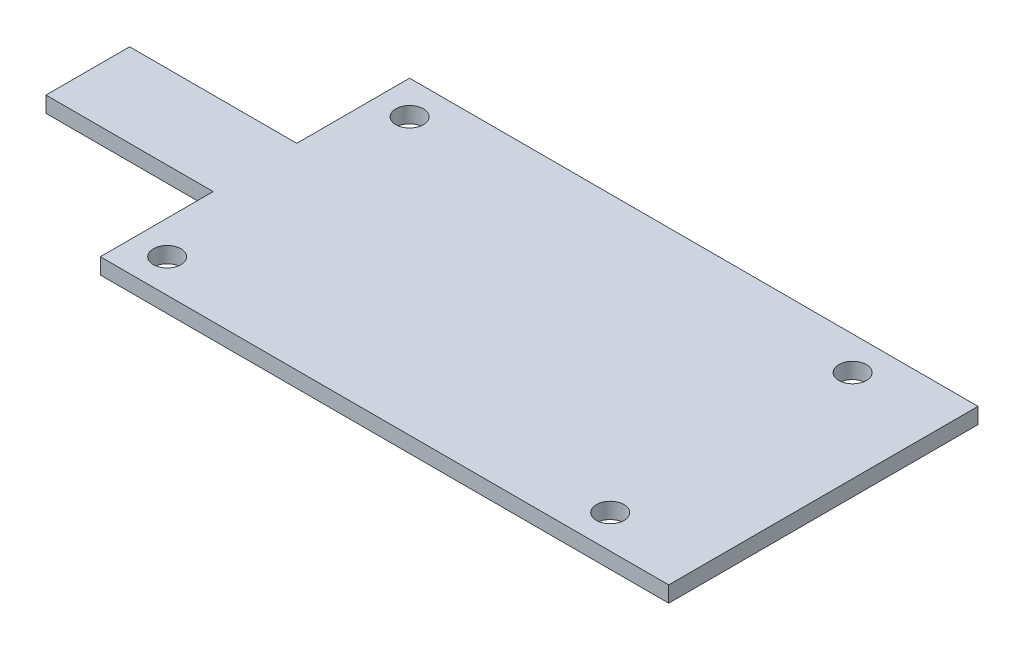
ISO-10303-21;
HEADER;
FILE_DESCRIPTION(('STEP AP214'),'2;1');
FILE_NAME('part.step','',(''),(''),'','','');
FILE_SCHEMA(('AUTOMOTIVE_DESIGN { 1 0 10303 214 1 1 1 1 }'));
ENDSEC;
DATA;
#1=APPLICATION_CONTEXT('core data for automotive mechanical design processes');
#2=APPLICATION_PROTOCOL_DEFINITION('international standard','automotive_design',2000,#1);
#3=PRODUCT_CONTEXT('',#1,'mechanical');
#4=PRODUCT('Part','Part','',(#3));
#5=PRODUCT_RELATED_PRODUCT_CATEGORY('part','',(#4));
#6=PRODUCT_DEFINITION_FORMATION('','',#4);
#7=PRODUCT_DEFINITION_CONTEXT('part definition',#1,'design');
#8=PRODUCT_DEFINITION('design','',#6,#7);
#9=PRODUCT_DEFINITION_SHAPE('','',#8);
#10=(LENGTH_UNIT() NAMED_UNIT(*) SI_UNIT(.MILLI.,.METRE.));
#11=(NAMED_UNIT(*) PLANE_ANGLE_UNIT() SI_UNIT($,.RADIAN.));
#12=(NAMED_UNIT(*) SI_UNIT($,.STERADIAN.) SOLID_ANGLE_UNIT());
#13=UNCERTAINTY_MEASURE_WITH_UNIT(LENGTH_MEASURE(1.E-05),#10,'distance_accuracy_value','');
#14=(GEOMETRIC_REPRESENTATION_CONTEXT(3) GLOBAL_UNCERTAINTY_ASSIGNED_CONTEXT((#13)) GLOBAL_UNIT_ASSIGNED_CONTEXT((#10,
#11,#12)) REPRESENTATION_CONTEXT('',''));
#15=CARTESIAN_POINT('',(0.,0.,0.));
#16=DIRECTION('',(0.,0.,1.));
#17=DIRECTION('',(1.,0.,0.));
#18=AXIS2_PLACEMENT_3D('',#15,#16,#17);
#19=CARTESIAN_POINT('',(0.,1.9,0.));
#20=DIRECTION('',(0.,1.,0.));
#21=DIRECTION('',(0.,0.,1.));
#22=AXIS2_PLACEMENT_3D('',#19,#20,#21);
#23=PLANE('',#22);
#24=CARTESIAN_POINT('',(26.5,1.9,14.5));
#25=DIRECTION('',(0.,1.,0.));
#26=DIRECTION('',(0.,0.,1.));
#27=AXIS2_PLACEMENT_3D('',#24,#25,#26);
#28=CIRCLE('',#27,1.65);
#29=CARTESIAN_POINT('',(26.5,1.9,12.85));
#30=VERTEX_POINT('',#29);
#31=EDGE_CURVE('E188',#30,#30,#28,.T.);
#32=ORIENTED_EDGE('',*,*,#31,.F.);
#33=EDGE_LOOP('',(#32));
#34=FACE_BOUND('',#33,.T.);
#35=CARTESIAN_POINT('',(-26.5,1.9,-14.5));
#36=DIRECTION('',(0.,1.,0.));
#37=DIRECTION('',(0.,0.,1.));
#38=AXIS2_PLACEMENT_3D('',#35,#36,#37);
#39=CIRCLE('',#38,1.65);
#40=CARTESIAN_POINT('',(-26.5,1.9,-16.15));
#41=VERTEX_POINT('',#40);
#42=EDGE_CURVE('E134',#41,#41,#39,.T.);
#43=ORIENTED_EDGE('',*,*,#42,.F.);
#44=EDGE_LOOP('',(#43));
#45=FACE_BOUND('',#44,.T.);
#46=DIRECTION('',(0.,0.,1.));
#47=VECTOR('',#46,1.);
#48=CARTESIAN_POINT('',(-30.5,1.9,-18.5));
#49=LINE('',#48,#47);
#50=CARTESIAN_POINT('',(-30.5,1.9,-18.5));
#51=VERTEX_POINT('',#50);
#52=CARTESIAN_POINT('',(-30.5,1.9,-5.));
#53=VERTEX_POINT('',#52);
#54=EDGE_CURVE('E147',#51,#53,#49,.T.);
#55=ORIENTED_EDGE('',*,*,#54,.T.);
#56=DIRECTION('',(-1.,0.,0.));
#57=VECTOR('',#56,1.);
#58=CARTESIAN_POINT('',(-50.5,1.9,-5.));
#59=LINE('',#58,#57);
#60=CARTESIAN_POINT('',(-50.5,1.9,-5.));
#61=VERTEX_POINT('',#60);
#62=EDGE_CURVE('E91',#53,#61,#59,.T.);
#63=ORIENTED_EDGE('',*,*,#62,.T.);
#64=DIRECTION('',(0.,0.,1.));
#65=VECTOR('',#64,1.);
#66=CARTESIAN_POINT('',(-50.5,1.9,5.));
#67=LINE('',#66,#65);
#68=CARTESIAN_POINT('',(-50.5,1.9,5.));
#69=VERTEX_POINT('',#68);
#70=EDGE_CURVE('E162',#61,#69,#67,.T.);
#71=ORIENTED_EDGE('',*,*,#70,.T.);
#72=DIRECTION('',(1.,0.,0.));
#73=VECTOR('',#72,1.);
#74=CARTESIAN_POINT('',(-30.5,1.9,5.));
#75=LINE('',#74,#73);
#76=CARTESIAN_POINT('',(-30.5,1.9,5.));
#77=VERTEX_POINT('',#76);
#78=EDGE_CURVE('E173',#69,#77,#75,.T.);
#79=ORIENTED_EDGE('',*,*,#78,.T.);
#80=DIRECTION('',(0.,0.,1.));
#81=VECTOR('',#80,1.);
#82=CARTESIAN_POINT('',(-30.5,1.9,18.5));
#83=LINE('',#82,#81);
#84=CARTESIAN_POINT('',(-30.5,1.9,18.5));
#85=VERTEX_POINT('',#84);
#86=EDGE_CURVE('E111',#77,#85,#83,.T.);
#87=ORIENTED_EDGE('',*,*,#86,.T.);
#88=DIRECTION('',(1.,0.,0.));
#89=VECTOR('',#88,1.);
#90=CARTESIAN_POINT('',(-30.5,1.9,18.5));
#91=LINE('',#90,#89);
#92=CARTESIAN_POINT('',(37.5,1.9,18.5));
#93=VERTEX_POINT('',#92);
#94=EDGE_CURVE('E104',#85,#93,#91,.T.);
#95=ORIENTED_EDGE('',*,*,#94,.T.);
#96=DIRECTION('',(0.,0.,-1.));
#97=VECTOR('',#96,1.);
#98=CARTESIAN_POINT('',(37.5,1.9,-18.5));
#99=LINE('',#98,#97);
#100=CARTESIAN_POINT('',(37.5,1.9,-18.5));
#101=VERTEX_POINT('',#100);
#102=EDGE_CURVE('E108',#93,#101,#99,.T.);
#103=ORIENTED_EDGE('',*,*,#102,.T.);
#104=DIRECTION('',(-1.,0.,0.));
#105=VECTOR('',#104,1.);
#106=CARTESIAN_POINT('',(30.5,1.9,-18.5));
#107=LINE('',#106,#105);
#108=EDGE_CURVE('E50',#101,#51,#107,.T.);
#109=ORIENTED_EDGE('',*,*,#108,.T.);
#110=EDGE_LOOP('',(#55,#63,#71,#79,#87,#95,#103,#109));
#111=FACE_BOUND('',#110,.T.);
#112=CARTESIAN_POINT('',(26.5,1.9,-14.5));
#113=DIRECTION('',(0.,1.,0.));
#114=DIRECTION('',(0.,0.,1.));
#115=AXIS2_PLACEMENT_3D('',#112,#113,#114);
#116=CIRCLE('',#115,1.65);
#117=CARTESIAN_POINT('',(26.5,1.9,-16.15));
#118=VERTEX_POINT('',#117);
#119=EDGE_CURVE('E182',#118,#118,#116,.T.);
#120=ORIENTED_EDGE('',*,*,#119,.F.);
#121=EDGE_LOOP('',(#120));
#122=FACE_BOUND('',#121,.T.);
#123=CARTESIAN_POINT('',(-26.5,1.9,14.5));
#124=DIRECTION('',(0.,1.,0.));
#125=DIRECTION('',(0.,0.,1.));
#126=AXIS2_PLACEMENT_3D('',#123,#124,#125);
#127=CIRCLE('',#126,1.65);
#128=CARTESIAN_POINT('',(-26.5,1.9,12.85));
#129=VERTEX_POINT('',#128);
#130=EDGE_CURVE('E194',#129,#129,#127,.T.);
#131=ORIENTED_EDGE('',*,*,#130,.F.);
#132=EDGE_LOOP('',(#131));
#133=FACE_BOUND('',#132,.T.);
#134=ADVANCED_FACE('F33',(#34,#45,#111,#122,#133),#23,.T.);
#135=CARTESIAN_POINT('',(0.,0.,0.));
#136=DIRECTION('',(0.,1.,0.));
#137=DIRECTION('',(0.,0.,1.));
#138=AXIS2_PLACEMENT_3D('',#135,#136,#137);
#139=PLANE('',#138);
#140=DIRECTION('',(0.,0.,1.));
#141=VECTOR('',#140,1.);
#142=CARTESIAN_POINT('',(-30.5,0.,-18.5));
#143=LINE('',#142,#141);
#144=CARTESIAN_POINT('',(-30.5,0.,-18.5));
#145=VERTEX_POINT('',#144);
#146=CARTESIAN_POINT('',(-30.5,0.,-5.));
#147=VERTEX_POINT('',#146);
#148=EDGE_CURVE('E130',#145,#147,#143,.T.);
#149=ORIENTED_EDGE('',*,*,#148,.F.);
#150=DIRECTION('',(-1.,0.,0.));
#151=VECTOR('',#150,1.);
#152=CARTESIAN_POINT('',(-30.5,0.,-18.5));
#153=LINE('',#152,#151);
#154=CARTESIAN_POINT('',(37.5,0.,-18.5));
#155=VERTEX_POINT('',#154);
#156=EDGE_CURVE('E79',#155,#145,#153,.T.);
#157=ORIENTED_EDGE('',*,*,#156,.F.);
#158=DIRECTION('',(0.,0.,-1.));
#159=VECTOR('',#158,1.);
#160=CARTESIAN_POINT('',(37.5,0.,-18.5));
#161=LINE('',#160,#159);
#162=CARTESIAN_POINT('',(37.5,0.,18.5));
#163=VERTEX_POINT('',#162);
#164=EDGE_CURVE('E144',#163,#155,#161,.T.);
#165=ORIENTED_EDGE('',*,*,#164,.F.);
#166=DIRECTION('',(1.,0.,0.));
#167=VECTOR('',#166,1.);
#168=CARTESIAN_POINT('',(37.5,0.,18.5));
#169=LINE('',#168,#167);
#170=CARTESIAN_POINT('',(-30.5,0.,18.5));
#171=VERTEX_POINT('',#170);
#172=EDGE_CURVE('E119',#171,#163,#169,.T.);
#173=ORIENTED_EDGE('',*,*,#172,.F.);
#174=DIRECTION('',(0.,0.,1.));
#175=VECTOR('',#174,1.);
#176=CARTESIAN_POINT('',(-30.5,0.,18.5));
#177=LINE('',#176,#175);
#178=CARTESIAN_POINT('',(-30.5,0.,5.));
#179=VERTEX_POINT('',#178);
#180=EDGE_CURVE('E140',#179,#171,#177,.T.);
#181=ORIENTED_EDGE('',*,*,#180,.F.);
#182=DIRECTION('',(1.,0.,0.));
#183=VECTOR('',#182,1.);
#184=CARTESIAN_POINT('',(-30.5,0.,5.));
#185=LINE('',#184,#183);
#186=CARTESIAN_POINT('',(-50.5,0.,5.));
#187=VERTEX_POINT('',#186);
#188=EDGE_CURVE('E138',#187,#179,#185,.T.);
#189=ORIENTED_EDGE('',*,*,#188,.F.);
#190=DIRECTION('',(0.,0.,1.));
#191=VECTOR('',#190,1.);
#192=CARTESIAN_POINT('',(-50.5,0.,5.));
#193=LINE('',#192,#191);
#194=CARTESIAN_POINT('',(-50.5,0.,-5.));
#195=VERTEX_POINT('',#194);
#196=EDGE_CURVE('E136',#195,#187,#193,.T.);
#197=ORIENTED_EDGE('',*,*,#196,.F.);
#198=DIRECTION('',(-1.,0.,0.));
#199=VECTOR('',#198,1.);
#200=CARTESIAN_POINT('',(-50.5,0.,-5.));
#201=LINE('',#200,#199);
#202=EDGE_CURVE('E133',#147,#195,#201,.T.);
#203=ORIENTED_EDGE('',*,*,#202,.F.);
#204=EDGE_LOOP('',(#149,#157,#165,#173,#181,#189,#197,#203));
#205=FACE_BOUND('',#204,.T.);
#206=CARTESIAN_POINT('',(-26.5,0.,-14.5));
#207=DIRECTION('',(0.,1.,0.));
#208=DIRECTION('',(0.,0.,1.));
#209=AXIS2_PLACEMENT_3D('',#206,#207,#208);
#210=CIRCLE('',#209,1.65);
#211=CARTESIAN_POINT('',(-26.5,0.,-16.15));
#212=VERTEX_POINT('',#211);
#213=EDGE_CURVE('E179',#212,#212,#210,.T.);
#214=ORIENTED_EDGE('',*,*,#213,.T.);
#215=EDGE_LOOP('',(#214));
#216=FACE_BOUND('',#215,.T.);
#217=CARTESIAN_POINT('',(26.5,0.,-14.5));
#218=DIRECTION('',(0.,1.,0.));
#219=DIRECTION('',(0.,0.,1.));
#220=AXIS2_PLACEMENT_3D('',#217,#218,#219);
#221=CIRCLE('',#220,1.65);
#222=CARTESIAN_POINT('',(26.5,0.,-16.15));
#223=VERTEX_POINT('',#222);
#224=EDGE_CURVE('E185',#223,#223,#221,.T.);
#225=ORIENTED_EDGE('',*,*,#224,.T.);
#226=EDGE_LOOP('',(#225));
#227=FACE_BOUND('',#226,.T.);
#228=CARTESIAN_POINT('',(26.5,0.,14.5));
#229=DIRECTION('',(0.,1.,0.));
#230=DIRECTION('',(0.,0.,1.));
#231=AXIS2_PLACEMENT_3D('',#228,#229,#230);
#232=CIRCLE('',#231,1.65);
#233=CARTESIAN_POINT('',(26.5,0.,12.85));
#234=VERTEX_POINT('',#233);
#235=EDGE_CURVE('E191',#234,#234,#232,.T.);
#236=ORIENTED_EDGE('',*,*,#235,.T.);
#237=EDGE_LOOP('',(#236));
#238=FACE_BOUND('',#237,.T.);
#239=CARTESIAN_POINT('',(-26.5,0.,14.5));
#240=DIRECTION('',(0.,1.,0.));
#241=DIRECTION('',(0.,0.,1.));
#242=AXIS2_PLACEMENT_3D('',#239,#240,#241);
#243=CIRCLE('',#242,1.65);
#244=CARTESIAN_POINT('',(-26.5,0.,12.85));
#245=VERTEX_POINT('',#244);
#246=EDGE_CURVE('E197',#245,#245,#243,.T.);
#247=ORIENTED_EDGE('',*,*,#246,.T.);
#248=EDGE_LOOP('',(#247));
#249=FACE_BOUND('',#248,.T.);
#250=ADVANCED_FACE('F164',(#205,#216,#227,#238,#249),#139,.F.);
#251=CARTESIAN_POINT('',(-30.5,1.9,-18.5));
#252=DIRECTION('',(1.,0.,0.));
#253=DIRECTION('',(0.,0.,-1.));
#254=AXIS2_PLACEMENT_3D('',#251,#252,#253);
#255=PLANE('',#254);
#256=ORIENTED_EDGE('',*,*,#148,.T.);
#257=DIRECTION('',(0.,-1.,0.));
#258=VECTOR('',#257,1.);
#259=CARTESIAN_POINT('',(-30.5,1.9,-5.));
#260=LINE('',#259,#258);
#261=EDGE_CURVE('E11',#53,#147,#260,.T.);
#262=ORIENTED_EDGE('',*,*,#261,.F.);
#263=ORIENTED_EDGE('',*,*,#54,.F.);
#264=DIRECTION('',(0.,-1.,0.));
#265=VECTOR('',#264,1.);
#266=CARTESIAN_POINT('',(-30.5,1.9,-18.5));
#267=LINE('',#266,#265);
#268=EDGE_CURVE('E126',#51,#145,#267,.T.);
#269=ORIENTED_EDGE('',*,*,#268,.T.);
#270=EDGE_LOOP('',(#256,#262,#263,#269));
#271=FACE_BOUND('',#270,.T.);
#272=ADVANCED_FACE('F35',(#271),#255,.F.);
#273=CARTESIAN_POINT('',(-50.5,1.9,-5.));
#274=DIRECTION('',(0.,0.,1.));
#275=DIRECTION('',(1.,0.,0.));
#276=AXIS2_PLACEMENT_3D('',#273,#274,#275);
#277=PLANE('',#276);
#278=ORIENTED_EDGE('',*,*,#202,.T.);
#279=DIRECTION('',(0.,-1.,0.));
#280=VECTOR('',#279,1.);
#281=CARTESIAN_POINT('',(-50.5,1.9,-5.));
#282=LINE('',#281,#280);
#283=EDGE_CURVE('E42',#61,#195,#282,.T.);
#284=ORIENTED_EDGE('',*,*,#283,.F.);
#285=ORIENTED_EDGE('',*,*,#62,.F.);
#286=ORIENTED_EDGE('',*,*,#261,.T.);
#287=EDGE_LOOP('',(#278,#284,#285,#286));
#288=FACE_BOUND('',#287,.T.);
#289=ADVANCED_FACE('F231',(#288),#277,.F.);
#290=CARTESIAN_POINT('',(-50.5,1.9,5.));
#291=DIRECTION('',(1.,0.,0.));
#292=DIRECTION('',(0.,0.,-1.));
#293=AXIS2_PLACEMENT_3D('',#290,#291,#292);
#294=PLANE('',#293);
#295=ORIENTED_EDGE('',*,*,#196,.T.);
#296=DIRECTION('',(0.,-1.,0.));
#297=VECTOR('',#296,1.);
#298=CARTESIAN_POINT('',(-50.5,1.9,5.));
#299=LINE('',#298,#297);
#300=EDGE_CURVE('E154',#69,#187,#299,.T.);
#301=ORIENTED_EDGE('',*,*,#300,.F.);
#302=ORIENTED_EDGE('',*,*,#70,.F.);
#303=ORIENTED_EDGE('',*,*,#283,.T.);
#304=EDGE_LOOP('',(#295,#301,#302,#303));
#305=FACE_BOUND('',#304,.T.);
#306=ADVANCED_FACE('F160',(#305),#294,.F.);
#307=CARTESIAN_POINT('',(-30.5,1.9,5.));
#308=DIRECTION('',(0.,0.,-1.));
#309=DIRECTION('',(-1.,0.,0.));
#310=AXIS2_PLACEMENT_3D('',#307,#308,#309);
#311=PLANE('',#310);
#312=ORIENTED_EDGE('',*,*,#188,.T.);
#313=DIRECTION('',(0.,-1.,0.));
#314=VECTOR('',#313,1.);
#315=CARTESIAN_POINT('',(-30.5,1.9,5.));
#316=LINE('',#315,#314);
#317=EDGE_CURVE('E151',#77,#179,#316,.T.);
#318=ORIENTED_EDGE('',*,*,#317,.F.);
#319=ORIENTED_EDGE('',*,*,#78,.F.);
#320=ORIENTED_EDGE('',*,*,#300,.T.);
#321=EDGE_LOOP('',(#312,#318,#319,#320));
#322=FACE_BOUND('',#321,.T.);
#323=ADVANCED_FACE('F169',(#322),#311,.F.);
#324=CARTESIAN_POINT('',(-30.5,1.9,18.5));
#325=DIRECTION('',(1.,0.,0.));
#326=DIRECTION('',(0.,0.,-1.));
#327=AXIS2_PLACEMENT_3D('',#324,#325,#326);
#328=PLANE('',#327);
#329=ORIENTED_EDGE('',*,*,#180,.T.);
#330=DIRECTION('',(0.,-1.,0.));
#331=VECTOR('',#330,1.);
#332=CARTESIAN_POINT('',(-30.5,1.9,18.5));
#333=LINE('',#332,#331);
#334=EDGE_CURVE('E121',#85,#171,#333,.T.);
#335=ORIENTED_EDGE('',*,*,#334,.F.);
#336=ORIENTED_EDGE('',*,*,#86,.F.);
#337=ORIENTED_EDGE('',*,*,#317,.T.);
#338=EDGE_LOOP('',(#329,#335,#336,#337));
#339=FACE_BOUND('',#338,.T.);
#340=ADVANCED_FACE('F172',(#339),#328,.F.);
#341=CARTESIAN_POINT('',(37.5,1.9,18.5));
#342=DIRECTION('',(0.,0.,-1.));
#343=DIRECTION('',(-1.,0.,0.));
#344=AXIS2_PLACEMENT_3D('',#341,#342,#343);
#345=PLANE('',#344);
#346=ORIENTED_EDGE('',*,*,#172,.T.);
#347=DIRECTION('',(0.,-1.,0.));
#348=VECTOR('',#347,1.);
#349=CARTESIAN_POINT('',(37.5,1.9,18.5));
#350=LINE('',#349,#348);
#351=EDGE_CURVE('E117',#93,#163,#350,.T.);
#352=ORIENTED_EDGE('',*,*,#351,.F.);
#353=ORIENTED_EDGE('',*,*,#94,.F.);
#354=ORIENTED_EDGE('',*,*,#334,.T.);
#355=EDGE_LOOP('',(#346,#352,#353,#354));
#356=FACE_BOUND('',#355,.T.);
#357=ADVANCED_FACE('F118',(#356),#345,.F.);
#358=CARTESIAN_POINT('',(37.5,1.9,-18.5));
#359=DIRECTION('',(-1.,0.,0.));
#360=DIRECTION('',(0.,0.,1.));
#361=AXIS2_PLACEMENT_3D('',#358,#359,#360);
#362=PLANE('',#361);
#363=ORIENTED_EDGE('',*,*,#164,.T.);
#364=DIRECTION('',(0.,-1.,0.));
#365=VECTOR('',#364,1.);
#366=CARTESIAN_POINT('',(37.5,1.9,-18.5));
#367=LINE('',#366,#365);
#368=EDGE_CURVE('E122',#101,#155,#367,.T.);
#369=ORIENTED_EDGE('',*,*,#368,.F.);
#370=ORIENTED_EDGE('',*,*,#102,.F.);
#371=ORIENTED_EDGE('',*,*,#351,.T.);
#372=EDGE_LOOP('',(#363,#369,#370,#371));
#373=FACE_BOUND('',#372,.T.);
#374=ADVANCED_FACE('F124',(#373),#362,.F.);
#375=CARTESIAN_POINT('',(-30.5,1.9,-18.5));
#376=DIRECTION('',(0.,0.,1.));
#377=DIRECTION('',(1.,0.,0.));
#378=AXIS2_PLACEMENT_3D('',#375,#376,#377);
#379=PLANE('',#378);
#380=ORIENTED_EDGE('',*,*,#156,.T.);
#381=ORIENTED_EDGE('',*,*,#268,.F.);
#382=ORIENTED_EDGE('',*,*,#108,.F.);
#383=ORIENTED_EDGE('',*,*,#368,.T.);
#384=EDGE_LOOP('',(#380,#381,#382,#383));
#385=FACE_BOUND('',#384,.T.);
#386=ADVANCED_FACE('F219',(#385),#379,.F.);
#387=CARTESIAN_POINT('',(-26.5,1.9,-14.5));
#388=DIRECTION('',(0.,-1.,0.));
#389=DIRECTION('',(0.,0.,-1.));
#390=AXIS2_PLACEMENT_3D('',#387,#388,#389);
#391=CYLINDRICAL_SURFACE('',#390,1.65);
#392=CARTESIAN_POINT('',(-26.5,1.9,-16.15));
#393=CARTESIAN_POINT('',(-26.5,1.88020833333333,-16.15));
#394=CARTESIAN_POINT('',(-26.5,1.86041666666667,-16.15));
#395=CARTESIAN_POINT('',(-26.5,1.82083333333333,-16.15));
#396=CARTESIAN_POINT('',(-26.5,1.80104166666667,-16.15));
#397=CARTESIAN_POINT('',(-26.5,1.76145833333333,-16.15));
#398=CARTESIAN_POINT('',(-26.5,1.74166666666667,-16.15));
#399=CARTESIAN_POINT('',(-26.5,1.70208333333333,-16.15));
#400=CARTESIAN_POINT('',(-26.5,1.68229166666667,-16.15));
#401=CARTESIAN_POINT('',(-26.5,1.64270833333333,-16.15));
#402=CARTESIAN_POINT('',(-26.5,1.62291666666667,-16.15));
#403=CARTESIAN_POINT('',(-26.5,1.58333333333333,-16.15));
#404=CARTESIAN_POINT('',(-26.5,1.56354166666667,-16.15));
#405=CARTESIAN_POINT('',(-26.5,1.52395833333333,-16.15));
#406=CARTESIAN_POINT('',(-26.5,1.50416666666667,-16.15));
#407=CARTESIAN_POINT('',(-26.5,1.46458333333333,-16.15));
#408=CARTESIAN_POINT('',(-26.5,1.44479166666667,-16.15));
#409=CARTESIAN_POINT('',(-26.5,1.40520833333333,-16.15));
#410=CARTESIAN_POINT('',(-26.5,1.38541666666667,-16.15));
#411=CARTESIAN_POINT('',(-26.5,1.34583333333333,-16.15));
#412=CARTESIAN_POINT('',(-26.5,1.32604166666667,-16.15));
#413=CARTESIAN_POINT('',(-26.5,1.28645833333333,-16.15));
#414=CARTESIAN_POINT('',(-26.5,1.26666666666667,-16.15));
#415=CARTESIAN_POINT('',(-26.5,1.22708333333333,-16.15));
#416=CARTESIAN_POINT('',(-26.5,1.20729166666667,-16.15));
#417=CARTESIAN_POINT('',(-26.5,1.16770833333333,-16.15));
#418=CARTESIAN_POINT('',(-26.5,1.14791666666667,-16.15));
#419=CARTESIAN_POINT('',(-26.5,1.10833333333333,-16.15));
#420=CARTESIAN_POINT('',(-26.5,1.08854166666667,-16.15));
#421=CARTESIAN_POINT('',(-26.5,1.04895833333333,-16.15));
#422=CARTESIAN_POINT('',(-26.5,1.02916666666667,-16.15));
#423=CARTESIAN_POINT('',(-26.5,0.989583333333333,-16.15));
#424=CARTESIAN_POINT('',(-26.5,0.969791666666666,-16.15));
#425=CARTESIAN_POINT('',(-26.5,0.930208333333333,-16.15));
#426=CARTESIAN_POINT('',(-26.5,0.910416666666667,-16.15));
#427=CARTESIAN_POINT('',(-26.5,0.870833333333333,-16.15));
#428=CARTESIAN_POINT('',(-26.5,0.851041666666667,-16.15));
#429=CARTESIAN_POINT('',(-26.5,0.811458333333333,-16.15));
#430=CARTESIAN_POINT('',(-26.5,0.791666666666667,-16.15));
#431=CARTESIAN_POINT('',(-26.5,0.752083333333333,-16.15));
#432=CARTESIAN_POINT('',(-26.5,0.732291666666667,-16.15));
#433=CARTESIAN_POINT('',(-26.5,0.692708333333333,-16.15));
#434=CARTESIAN_POINT('',(-26.5,0.672916666666667,-16.15));
#435=CARTESIAN_POINT('',(-26.5,0.633333333333333,-16.15));
#436=CARTESIAN_POINT('',(-26.5,0.613541666666667,-16.15));
#437=CARTESIAN_POINT('',(-26.5,0.573958333333333,-16.15));
#438=CARTESIAN_POINT('',(-26.5,0.554166666666667,-16.15));
#439=CARTESIAN_POINT('',(-26.5,0.514583333333334,-16.15));
#440=CARTESIAN_POINT('',(-26.5,0.494791666666667,-16.15));
#441=CARTESIAN_POINT('',(-26.5,0.455208333333333,-16.15));
#442=CARTESIAN_POINT('',(-26.5,0.435416666666667,-16.15));
#443=CARTESIAN_POINT('',(-26.5,0.395833333333333,-16.15));
#444=CARTESIAN_POINT('',(-26.5,0.376041666666667,-16.15));
#445=CARTESIAN_POINT('',(-26.5,0.336458333333333,-16.15));
#446=CARTESIAN_POINT('',(-26.5,0.316666666666667,-16.15));
#447=CARTESIAN_POINT('',(-26.5,0.277083333333333,-16.15));
#448=CARTESIAN_POINT('',(-26.5,0.257291666666667,-16.15));
#449=CARTESIAN_POINT('',(-26.5,0.217708333333333,-16.15));
#450=CARTESIAN_POINT('',(-26.5,0.197916666666667,-16.15));
#451=CARTESIAN_POINT('',(-26.5,0.158333333333333,-16.15));
#452=CARTESIAN_POINT('',(-26.5,0.138541666666667,-16.15));
#453=CARTESIAN_POINT('',(-26.5,0.0989583333333333,-16.15));
#454=CARTESIAN_POINT('',(-26.5,0.0791666666666666,-16.15));
#455=CARTESIAN_POINT('',(-26.5,0.0395833333333333,-16.15));
#456=CARTESIAN_POINT('',(-26.5,0.0197916666666666,-16.15));
#457=CARTESIAN_POINT('',(-26.5,0.,-16.15));
#458=B_SPLINE_CURVE_WITH_KNOTS('',3,(#392,#393,#394,#395,#396,#397,#398,#399,#400,#401,#402,
#403,#404,#405,#406,#407,#408,#409,#410,#411,#412,#413,#414,#415,#416,#417,#418,#419,#420,#421,
#422,#423,#424,#425,#426,#427,#428,#429,#430,#431,#432,#433,#434,#435,#436,#437,#438,#439,#440,
#441,#442,#443,#444,#445,#446,#447,#448,#449,#450,#451,#452,#453,#454,#455,#456,#457),
.UNSPECIFIED.,.F.,.F.,(4,2,2,2,2,2,2,2,2,2,2,2,2,2,2,2,2,2,2,2,2,2,2,2,2,2,2,2,2,2,2,2,4),(0.,
0.0593750000000002,0.11875,0.178125,0.2375,0.296875,0.35625,0.415625,0.475,0.534375,0.59375,
0.653125,0.7125,0.771875,0.83125,0.890625,0.95,1.009375,1.06875,1.128125,1.1875,1.246875,
1.30625,1.365625,1.425,1.484375,1.54375,1.603125,1.6625,1.721875,1.78125,1.840625,1.9),.UNSPECIFIED.);
#459=EDGE_CURVE('BSEAM216',#41,#212,#458,.T.);
#460=ORIENTED_EDGE('',*,*,#42,.T.);
#461=ORIENTED_EDGE('',*,*,#213,.F.);
#462=ORIENTED_EDGE('',*,*,#459,.T.);
#463=ORIENTED_EDGE('',*,*,#459,.F.);
#464=EDGE_LOOP('',(#460,#462,#461,#463));
#465=FACE_BOUND('',#464,.T.);
#466=ADVANCED_FACE('F216',(#465),#391,.F.);
#467=CARTESIAN_POINT('',(26.5,1.9,-14.5));
#468=DIRECTION('',(0.,-1.,0.));
#469=DIRECTION('',(0.,0.,-1.));
#470=AXIS2_PLACEMENT_3D('',#467,#468,#469);
#471=CYLINDRICAL_SURFACE('',#470,1.65);
#472=CARTESIAN_POINT('',(26.5,1.9,-16.15));
#473=CARTESIAN_POINT('',(26.5,1.88020833333333,-16.15));
#474=CARTESIAN_POINT('',(26.5,1.86041666666667,-16.15));
#475=CARTESIAN_POINT('',(26.5,1.82083333333333,-16.15));
#476=CARTESIAN_POINT('',(26.5,1.80104166666667,-16.15));
#477=CARTESIAN_POINT('',(26.5,1.76145833333333,-16.15));
#478=CARTESIAN_POINT('',(26.5,1.74166666666667,-16.15));
#479=CARTESIAN_POINT('',(26.5,1.70208333333333,-16.15));
#480=CARTESIAN_POINT('',(26.5,1.68229166666667,-16.15));
#481=CARTESIAN_POINT('',(26.5,1.64270833333333,-16.15));
#482=CARTESIAN_POINT('',(26.5,1.62291666666667,-16.15));
#483=CARTESIAN_POINT('',(26.5,1.58333333333333,-16.15));
#484=CARTESIAN_POINT('',(26.5,1.56354166666667,-16.15));
#485=CARTESIAN_POINT('',(26.5,1.52395833333333,-16.15));
#486=CARTESIAN_POINT('',(26.5,1.50416666666667,-16.15));
#487=CARTESIAN_POINT('',(26.5,1.46458333333333,-16.15));
#488=CARTESIAN_POINT('',(26.5,1.44479166666667,-16.15));
#489=CARTESIAN_POINT('',(26.5,1.40520833333333,-16.15));
#490=CARTESIAN_POINT('',(26.5,1.38541666666667,-16.15));
#491=CARTESIAN_POINT('',(26.5,1.34583333333333,-16.15));
#492=CARTESIAN_POINT('',(26.5,1.32604166666667,-16.15));
#493=CARTESIAN_POINT('',(26.5,1.28645833333333,-16.15));
#494=CARTESIAN_POINT('',(26.5,1.26666666666667,-16.15));
#495=CARTESIAN_POINT('',(26.5,1.22708333333333,-16.15));
#496=CARTESIAN_POINT('',(26.5,1.20729166666667,-16.15));
#497=CARTESIAN_POINT('',(26.5,1.16770833333333,-16.15));
#498=CARTESIAN_POINT('',(26.5,1.14791666666667,-16.15));
#499=CARTESIAN_POINT('',(26.5,1.10833333333333,-16.15));
#500=CARTESIAN_POINT('',(26.5,1.08854166666667,-16.15));
#501=CARTESIAN_POINT('',(26.5,1.04895833333333,-16.15));
#502=CARTESIAN_POINT('',(26.5,1.02916666666667,-16.15));
#503=CARTESIAN_POINT('',(26.5,0.989583333333333,-16.15));
#504=CARTESIAN_POINT('',(26.5,0.969791666666666,-16.15));
#505=CARTESIAN_POINT('',(26.5,0.930208333333333,-16.15));
#506=CARTESIAN_POINT('',(26.5,0.910416666666667,-16.15));
#507=CARTESIAN_POINT('',(26.5,0.870833333333333,-16.15));
#508=CARTESIAN_POINT('',(26.5,0.851041666666667,-16.15));
#509=CARTESIAN_POINT('',(26.5,0.811458333333333,-16.15));
#510=CARTESIAN_POINT('',(26.5,0.791666666666667,-16.15));
#511=CARTESIAN_POINT('',(26.5,0.752083333333333,-16.15));
#512=CARTESIAN_POINT('',(26.5,0.732291666666667,-16.15));
#513=CARTESIAN_POINT('',(26.5,0.692708333333333,-16.15));
#514=CARTESIAN_POINT('',(26.5,0.672916666666667,-16.15));
#515=CARTESIAN_POINT('',(26.5,0.633333333333333,-16.15));
#516=CARTESIAN_POINT('',(26.5,0.613541666666667,-16.15));
#517=CARTESIAN_POINT('',(26.5,0.573958333333333,-16.15));
#518=CARTESIAN_POINT('',(26.5,0.554166666666667,-16.15));
#519=CARTESIAN_POINT('',(26.5,0.514583333333334,-16.15));
#520=CARTESIAN_POINT('',(26.5,0.494791666666667,-16.15));
#521=CARTESIAN_POINT('',(26.5,0.455208333333333,-16.15));
#522=CARTESIAN_POINT('',(26.5,0.435416666666667,-16.15));
#523=CARTESIAN_POINT('',(26.5,0.395833333333333,-16.15));
#524=CARTESIAN_POINT('',(26.5,0.376041666666667,-16.15));
#525=CARTESIAN_POINT('',(26.5,0.336458333333333,-16.15));
#526=CARTESIAN_POINT('',(26.5,0.316666666666667,-16.15));
#527=CARTESIAN_POINT('',(26.5,0.277083333333333,-16.15));
#528=CARTESIAN_POINT('',(26.5,0.257291666666667,-16.15));
#529=CARTESIAN_POINT('',(26.5,0.217708333333333,-16.15));
#530=CARTESIAN_POINT('',(26.5,0.197916666666667,-16.15));
#531=CARTESIAN_POINT('',(26.5,0.158333333333333,-16.15));
#532=CARTESIAN_POINT('',(26.5,0.138541666666667,-16.15));
#533=CARTESIAN_POINT('',(26.5,0.0989583333333333,-16.15));
#534=CARTESIAN_POINT('',(26.5,0.0791666666666666,-16.15));
#535=CARTESIAN_POINT('',(26.5,0.0395833333333333,-16.15));
#536=CARTESIAN_POINT('',(26.5,0.0197916666666666,-16.15));
#537=CARTESIAN_POINT('',(26.5,0.,-16.15));
#538=B_SPLINE_CURVE_WITH_KNOTS('',3,(#472,#473,#474,#475,#476,#477,#478,#479,#480,#481,#482,
#483,#484,#485,#486,#487,#488,#489,#490,#491,#492,#493,#494,#495,#496,#497,#498,#499,#500,#501,
#502,#503,#504,#505,#506,#507,#508,#509,#510,#511,#512,#513,#514,#515,#516,#517,#518,#519,#520,
#521,#522,#523,#524,#525,#526,#527,#528,#529,#530,#531,#532,#533,#534,#535,#536,#537),
.UNSPECIFIED.,.F.,.F.,(4,2,2,2,2,2,2,2,2,2,2,2,2,2,2,2,2,2,2,2,2,2,2,2,2,2,2,2,2,2,2,2,4),(0.,
0.0593750000000002,0.11875,0.178125,0.2375,0.296875,0.35625,0.415625,0.475,0.534375,0.59375,
0.653125,0.7125,0.771875,0.83125,0.890625,0.95,1.009375,1.06875,1.128125,1.1875,1.246875,
1.30625,1.365625,1.425,1.484375,1.54375,1.603125,1.6625,1.721875,1.78125,1.840625,1.9),.UNSPECIFIED.);
#539=EDGE_CURVE('BSEAM301',#118,#223,#538,.T.);
#540=ORIENTED_EDGE('',*,*,#119,.T.);
#541=ORIENTED_EDGE('',*,*,#224,.F.);
#542=ORIENTED_EDGE('',*,*,#539,.T.);
#543=ORIENTED_EDGE('',*,*,#539,.F.);
#544=EDGE_LOOP('',(#540,#542,#541,#543));
#545=FACE_BOUND('',#544,.T.);
#546=ADVANCED_FACE('F301',(#545),#471,.F.);
#547=CARTESIAN_POINT('',(26.5,1.9,14.5));
#548=DIRECTION('',(0.,-1.,0.));
#549=DIRECTION('',(0.,0.,-1.));
#550=AXIS2_PLACEMENT_3D('',#547,#548,#549);
#551=CYLINDRICAL_SURFACE('',#550,1.65);
#552=CARTESIAN_POINT('',(26.5,1.9,12.85));
#553=CARTESIAN_POINT('',(26.5,1.88020833333333,12.85));
#554=CARTESIAN_POINT('',(26.5,1.86041666666667,12.85));
#555=CARTESIAN_POINT('',(26.5,1.82083333333333,12.85));
#556=CARTESIAN_POINT('',(26.5,1.80104166666667,12.85));
#557=CARTESIAN_POINT('',(26.5,1.76145833333333,12.85));
#558=CARTESIAN_POINT('',(26.5,1.74166666666667,12.85));
#559=CARTESIAN_POINT('',(26.5,1.70208333333333,12.85));
#560=CARTESIAN_POINT('',(26.5,1.68229166666667,12.85));
#561=CARTESIAN_POINT('',(26.5,1.64270833333333,12.85));
#562=CARTESIAN_POINT('',(26.5,1.62291666666667,12.85));
#563=CARTESIAN_POINT('',(26.5,1.58333333333333,12.85));
#564=CARTESIAN_POINT('',(26.5,1.56354166666667,12.85));
#565=CARTESIAN_POINT('',(26.5,1.52395833333333,12.85));
#566=CARTESIAN_POINT('',(26.5,1.50416666666667,12.85));
#567=CARTESIAN_POINT('',(26.5,1.46458333333333,12.85));
#568=CARTESIAN_POINT('',(26.5,1.44479166666667,12.85));
#569=CARTESIAN_POINT('',(26.5,1.40520833333333,12.85));
#570=CARTESIAN_POINT('',(26.5,1.38541666666667,12.85));
#571=CARTESIAN_POINT('',(26.5,1.34583333333333,12.85));
#572=CARTESIAN_POINT('',(26.5,1.32604166666667,12.85));
#573=CARTESIAN_POINT('',(26.5,1.28645833333333,12.85));
#574=CARTESIAN_POINT('',(26.5,1.26666666666667,12.85));
#575=CARTESIAN_POINT('',(26.5,1.22708333333333,12.85));
#576=CARTESIAN_POINT('',(26.5,1.20729166666667,12.85));
#577=CARTESIAN_POINT('',(26.5,1.16770833333333,12.85));
#578=CARTESIAN_POINT('',(26.5,1.14791666666667,12.85));
#579=CARTESIAN_POINT('',(26.5,1.10833333333333,12.85));
#580=CARTESIAN_POINT('',(26.5,1.08854166666667,12.85));
#581=CARTESIAN_POINT('',(26.5,1.04895833333333,12.85));
#582=CARTESIAN_POINT('',(26.5,1.02916666666667,12.85));
#583=CARTESIAN_POINT('',(26.5,0.989583333333333,12.85));
#584=CARTESIAN_POINT('',(26.5,0.969791666666666,12.85));
#585=CARTESIAN_POINT('',(26.5,0.930208333333333,12.85));
#586=CARTESIAN_POINT('',(26.5,0.910416666666667,12.85));
#587=CARTESIAN_POINT('',(26.5,0.870833333333333,12.85));
#588=CARTESIAN_POINT('',(26.5,0.851041666666667,12.85));
#589=CARTESIAN_POINT('',(26.5,0.811458333333333,12.85));
#590=CARTESIAN_POINT('',(26.5,0.791666666666667,12.85));
#591=CARTESIAN_POINT('',(26.5,0.752083333333333,12.85));
#592=CARTESIAN_POINT('',(26.5,0.732291666666667,12.85));
#593=CARTESIAN_POINT('',(26.5,0.692708333333333,12.85));
#594=CARTESIAN_POINT('',(26.5,0.672916666666667,12.85));
#595=CARTESIAN_POINT('',(26.5,0.633333333333333,12.85));
#596=CARTESIAN_POINT('',(26.5,0.613541666666667,12.85));
#597=CARTESIAN_POINT('',(26.5,0.573958333333333,12.85));
#598=CARTESIAN_POINT('',(26.5,0.554166666666667,12.85));
#599=CARTESIAN_POINT('',(26.5,0.514583333333334,12.85));
#600=CARTESIAN_POINT('',(26.5,0.494791666666667,12.85));
#601=CARTESIAN_POINT('',(26.5,0.455208333333333,12.85));
#602=CARTESIAN_POINT('',(26.5,0.435416666666667,12.85));
#603=CARTESIAN_POINT('',(26.5,0.395833333333333,12.85));
#604=CARTESIAN_POINT('',(26.5,0.376041666666667,12.85));
#605=CARTESIAN_POINT('',(26.5,0.336458333333333,12.85));
#606=CARTESIAN_POINT('',(26.5,0.316666666666667,12.85));
#607=CARTESIAN_POINT('',(26.5,0.277083333333333,12.85));
#608=CARTESIAN_POINT('',(26.5,0.257291666666667,12.85));
#609=CARTESIAN_POINT('',(26.5,0.217708333333333,12.85));
#610=CARTESIAN_POINT('',(26.5,0.197916666666667,12.85));
#611=CARTESIAN_POINT('',(26.5,0.158333333333333,12.85));
#612=CARTESIAN_POINT('',(26.5,0.138541666666667,12.85));
#613=CARTESIAN_POINT('',(26.5,0.0989583333333333,12.85));
#614=CARTESIAN_POINT('',(26.5,0.0791666666666666,12.85));
#615=CARTESIAN_POINT('',(26.5,0.0395833333333333,12.85));
#616=CARTESIAN_POINT('',(26.5,0.0197916666666666,12.85));
#617=CARTESIAN_POINT('',(26.5,0.,12.85));
#618=B_SPLINE_CURVE_WITH_KNOTS('',3,(#552,#553,#554,#555,#556,#557,#558,#559,#560,#561,#562,
#563,#564,#565,#566,#567,#568,#569,#570,#571,#572,#573,#574,#575,#576,#577,#578,#579,#580,#581,
#582,#583,#584,#585,#586,#587,#588,#589,#590,#591,#592,#593,#594,#595,#596,#597,#598,#599,#600,
#601,#602,#603,#604,#605,#606,#607,#608,#609,#610,#611,#612,#613,#614,#615,#616,#617),
.UNSPECIFIED.,.F.,.F.,(4,2,2,2,2,2,2,2,2,2,2,2,2,2,2,2,2,2,2,2,2,2,2,2,2,2,2,2,2,2,2,2,4),(0.,
0.0593750000000002,0.11875,0.178125,0.2375,0.296875,0.35625,0.415625,0.475,0.534375,0.59375,
0.653125,0.7125,0.771875,0.83125,0.890625,0.95,1.009375,1.06875,1.128125,1.1875,1.246875,
1.30625,1.365625,1.425,1.484375,1.54375,1.603125,1.6625,1.721875,1.78125,1.840625,1.9),.UNSPECIFIED.);
#619=EDGE_CURVE('BSEAM309',#30,#234,#618,.T.);
#620=ORIENTED_EDGE('',*,*,#31,.T.);
#621=ORIENTED_EDGE('',*,*,#235,.F.);
#622=ORIENTED_EDGE('',*,*,#619,.T.);
#623=ORIENTED_EDGE('',*,*,#619,.F.);
#624=EDGE_LOOP('',(#620,#622,#621,#623));
#625=FACE_BOUND('',#624,.T.);
#626=ADVANCED_FACE('F309',(#625),#551,.F.);
#627=CARTESIAN_POINT('',(-26.5,1.9,14.5));
#628=DIRECTION('',(0.,-1.,0.));
#629=DIRECTION('',(0.,0.,-1.));
#630=AXIS2_PLACEMENT_3D('',#627,#628,#629);
#631=CYLINDRICAL_SURFACE('',#630,1.65);
#632=CARTESIAN_POINT('',(-26.5,1.9,12.85));
#633=CARTESIAN_POINT('',(-26.5,1.88020833333333,12.85));
#634=CARTESIAN_POINT('',(-26.5,1.86041666666667,12.85));
#635=CARTESIAN_POINT('',(-26.5,1.82083333333333,12.85));
#636=CARTESIAN_POINT('',(-26.5,1.80104166666667,12.85));
#637=CARTESIAN_POINT('',(-26.5,1.76145833333333,12.85));
#638=CARTESIAN_POINT('',(-26.5,1.74166666666667,12.85));
#639=CARTESIAN_POINT('',(-26.5,1.70208333333333,12.85));
#640=CARTESIAN_POINT('',(-26.5,1.68229166666667,12.85));
#641=CARTESIAN_POINT('',(-26.5,1.64270833333333,12.85));
#642=CARTESIAN_POINT('',(-26.5,1.62291666666667,12.85));
#643=CARTESIAN_POINT('',(-26.5,1.58333333333333,12.85));
#644=CARTESIAN_POINT('',(-26.5,1.56354166666667,12.85));
#645=CARTESIAN_POINT('',(-26.5,1.52395833333333,12.85));
#646=CARTESIAN_POINT('',(-26.5,1.50416666666667,12.85));
#647=CARTESIAN_POINT('',(-26.5,1.46458333333333,12.85));
#648=CARTESIAN_POINT('',(-26.5,1.44479166666667,12.85));
#649=CARTESIAN_POINT('',(-26.5,1.40520833333333,12.85));
#650=CARTESIAN_POINT('',(-26.5,1.38541666666667,12.85));
#651=CARTESIAN_POINT('',(-26.5,1.34583333333333,12.85));
#652=CARTESIAN_POINT('',(-26.5,1.32604166666667,12.85));
#653=CARTESIAN_POINT('',(-26.5,1.28645833333333,12.85));
#654=CARTESIAN_POINT('',(-26.5,1.26666666666667,12.85));
#655=CARTESIAN_POINT('',(-26.5,1.22708333333333,12.85));
#656=CARTESIAN_POINT('',(-26.5,1.20729166666667,12.85));
#657=CARTESIAN_POINT('',(-26.5,1.16770833333333,12.85));
#658=CARTESIAN_POINT('',(-26.5,1.14791666666667,12.85));
#659=CARTESIAN_POINT('',(-26.5,1.10833333333333,12.85));
#660=CARTESIAN_POINT('',(-26.5,1.08854166666667,12.85));
#661=CARTESIAN_POINT('',(-26.5,1.04895833333333,12.85));
#662=CARTESIAN_POINT('',(-26.5,1.02916666666667,12.85));
#663=CARTESIAN_POINT('',(-26.5,0.989583333333333,12.85));
#664=CARTESIAN_POINT('',(-26.5,0.969791666666666,12.85));
#665=CARTESIAN_POINT('',(-26.5,0.930208333333333,12.85));
#666=CARTESIAN_POINT('',(-26.5,0.910416666666667,12.85));
#667=CARTESIAN_POINT('',(-26.5,0.870833333333333,12.85));
#668=CARTESIAN_POINT('',(-26.5,0.851041666666667,12.85));
#669=CARTESIAN_POINT('',(-26.5,0.811458333333333,12.85));
#670=CARTESIAN_POINT('',(-26.5,0.791666666666667,12.85));
#671=CARTESIAN_POINT('',(-26.5,0.752083333333333,12.85));
#672=CARTESIAN_POINT('',(-26.5,0.732291666666667,12.85));
#673=CARTESIAN_POINT('',(-26.5,0.692708333333333,12.85));
#674=CARTESIAN_POINT('',(-26.5,0.672916666666667,12.85));
#675=CARTESIAN_POINT('',(-26.5,0.633333333333333,12.85));
#676=CARTESIAN_POINT('',(-26.5,0.613541666666667,12.85));
#677=CARTESIAN_POINT('',(-26.5,0.573958333333333,12.85));
#678=CARTESIAN_POINT('',(-26.5,0.554166666666667,12.85));
#679=CARTESIAN_POINT('',(-26.5,0.514583333333334,12.85));
#680=CARTESIAN_POINT('',(-26.5,0.494791666666667,12.85));
#681=CARTESIAN_POINT('',(-26.5,0.455208333333333,12.85));
#682=CARTESIAN_POINT('',(-26.5,0.435416666666667,12.85));
#683=CARTESIAN_POINT('',(-26.5,0.395833333333333,12.85));
#684=CARTESIAN_POINT('',(-26.5,0.376041666666667,12.85));
#685=CARTESIAN_POINT('',(-26.5,0.336458333333333,12.85));
#686=CARTESIAN_POINT('',(-26.5,0.316666666666667,12.85));
#687=CARTESIAN_POINT('',(-26.5,0.277083333333333,12.85));
#688=CARTESIAN_POINT('',(-26.5,0.257291666666667,12.85));
#689=CARTESIAN_POINT('',(-26.5,0.217708333333333,12.85));
#690=CARTESIAN_POINT('',(-26.5,0.197916666666667,12.85));
#691=CARTESIAN_POINT('',(-26.5,0.158333333333333,12.85));
#692=CARTESIAN_POINT('',(-26.5,0.138541666666667,12.85));
#693=CARTESIAN_POINT('',(-26.5,0.0989583333333333,12.85));
#694=CARTESIAN_POINT('',(-26.5,0.0791666666666666,12.85));
#695=CARTESIAN_POINT('',(-26.5,0.0395833333333333,12.85));
#696=CARTESIAN_POINT('',(-26.5,0.0197916666666666,12.85));
#697=CARTESIAN_POINT('',(-26.5,0.,12.85));
#698=B_SPLINE_CURVE_WITH_KNOTS('',3,(#632,#633,#634,#635,#636,#637,#638,#639,#640,#641,#642,
#643,#644,#645,#646,#647,#648,#649,#650,#651,#652,#653,#654,#655,#656,#657,#658,#659,#660,#661,
#662,#663,#664,#665,#666,#667,#668,#669,#670,#671,#672,#673,#674,#675,#676,#677,#678,#679,#680,
#681,#682,#683,#684,#685,#686,#687,#688,#689,#690,#691,#692,#693,#694,#695,#696,#697),
.UNSPECIFIED.,.F.,.F.,(4,2,2,2,2,2,2,2,2,2,2,2,2,2,2,2,2,2,2,2,2,2,2,2,2,2,2,2,2,2,2,2,4),(0.,
0.0593750000000002,0.11875,0.178125,0.2375,0.296875,0.35625,0.415625,0.475,0.534375,0.59375,
0.653125,0.7125,0.771875,0.83125,0.890625,0.95,1.009375,1.06875,1.128125,1.1875,1.246875,
1.30625,1.365625,1.425,1.484375,1.54375,1.603125,1.6625,1.721875,1.78125,1.840625,1.9),.UNSPECIFIED.);
#699=EDGE_CURVE('BSEAM203',#129,#245,#698,.T.);
#700=ORIENTED_EDGE('',*,*,#130,.T.);
#701=ORIENTED_EDGE('',*,*,#246,.F.);
#702=ORIENTED_EDGE('',*,*,#699,.T.);
#703=ORIENTED_EDGE('',*,*,#699,.F.);
#704=EDGE_LOOP('',(#700,#702,#701,#703));
#705=FACE_BOUND('',#704,.T.);
#706=ADVANCED_FACE('F203',(#705),#631,.F.);
#707=CLOSED_SHELL('',(#134,#250,#272,#289,#306,#323,#340,#357,#374,#386,#466,#546,#626,#706));
#708=MANIFOLD_SOLID_BREP('B2',#707);
#709=ADVANCED_BREP_SHAPE_REPRESENTATION('',(#18,#708),#14);
#710=SHAPE_DEFINITION_REPRESENTATION(#9,#709);
ENDSEC;
END-ISO-10303-21;
